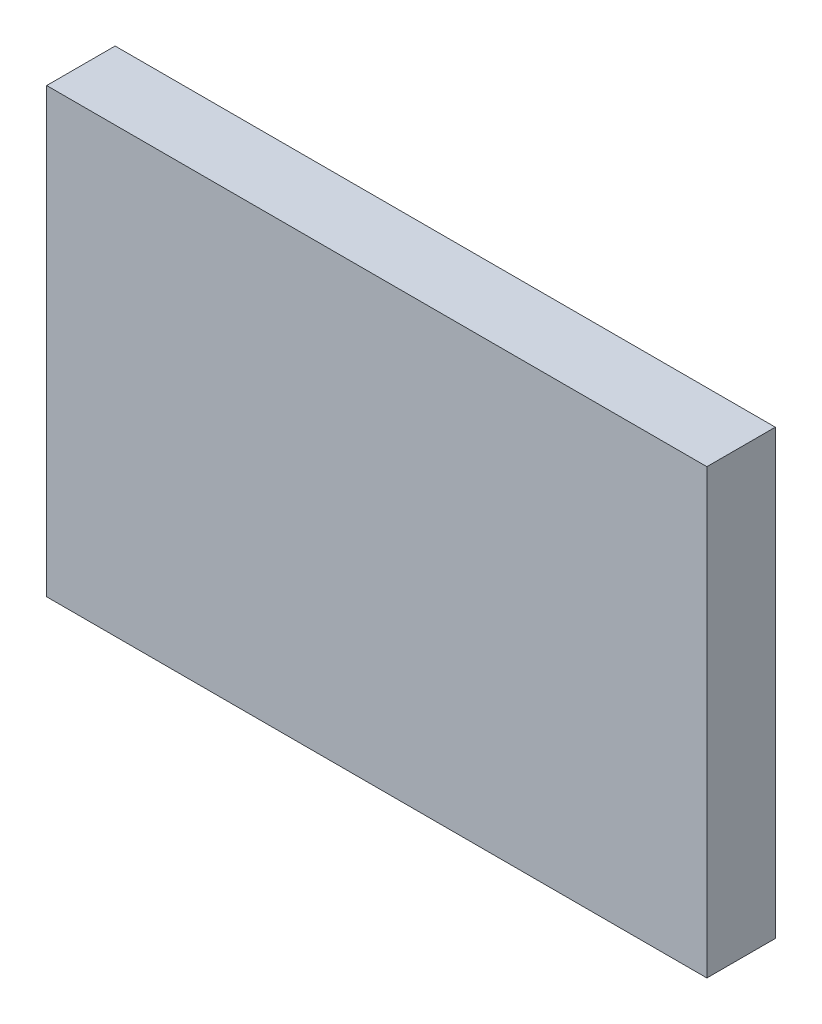
ISO-10303-21;
HEADER;
FILE_DESCRIPTION(('STEP AP214'),'2;1');
FILE_NAME('part.step','',(''),(''),'','','');
FILE_SCHEMA(('AUTOMOTIVE_DESIGN { 1 0 10303 214 1 1 1 1 }'));
ENDSEC;
DATA;
#1=APPLICATION_CONTEXT('core data for automotive mechanical design processes');
#2=APPLICATION_PROTOCOL_DEFINITION('international standard','automotive_design',2000,#1);
#3=PRODUCT_CONTEXT('',#1,'mechanical');
#4=PRODUCT('Part','Part','',(#3));
#5=PRODUCT_RELATED_PRODUCT_CATEGORY('part','',(#4));
#6=PRODUCT_DEFINITION_FORMATION('','',#4);
#7=PRODUCT_DEFINITION_CONTEXT('part definition',#1,'design');
#8=PRODUCT_DEFINITION('design','',#6,#7);
#9=PRODUCT_DEFINITION_SHAPE('','',#8);
#10=(LENGTH_UNIT() NAMED_UNIT(*) SI_UNIT(.MILLI.,.METRE.));
#11=(NAMED_UNIT(*) PLANE_ANGLE_UNIT() SI_UNIT($,.RADIAN.));
#12=(NAMED_UNIT(*) SI_UNIT($,.STERADIAN.) SOLID_ANGLE_UNIT());
#13=UNCERTAINTY_MEASURE_WITH_UNIT(LENGTH_MEASURE(1.E-05),#10,'distance_accuracy_value','');
#14=(GEOMETRIC_REPRESENTATION_CONTEXT(3) GLOBAL_UNCERTAINTY_ASSIGNED_CONTEXT((#13)) GLOBAL_UNIT_ASSIGNED_CONTEXT((#10,
#11,#12)) REPRESENTATION_CONTEXT('',''));
#15=CARTESIAN_POINT('',(0.,0.,0.));
#16=DIRECTION('',(0.,0.,1.));
#17=DIRECTION('',(1.,0.,0.));
#18=AXIS2_PLACEMENT_3D('',#15,#16,#17);
#19=CARTESIAN_POINT('',(-36.968497715082,19.8457446808511,8.5));
#20=DIRECTION('',(1.,0.,0.));
#21=DIRECTION('',(0.,0.,-1.));
#22=AXIS2_PLACEMENT_3D('',#19,#20,#21);
#23=PLANE('',#22);
#24=DIRECTION('',(0.,-1.,0.));
#25=VECTOR('',#24,1.);
#26=CARTESIAN_POINT('',(-36.968497715082,19.8457446808511,0.));
#27=LINE('',#26,#25);
#28=CARTESIAN_POINT('',(-36.968497715082,19.8457446808511,0.));
#29=VERTEX_POINT('',#28);
#30=CARTESIAN_POINT('',(-36.968497715082,-35.1542553191489,0.));
#31=VERTEX_POINT('',#30);
#32=EDGE_CURVE('E100',#29,#31,#27,.T.);
#33=ORIENTED_EDGE('',*,*,#32,.T.);
#34=DIRECTION('',(0.,0.,-1.));
#35=VECTOR('',#34,1.);
#36=CARTESIAN_POINT('',(-36.968497715082,-35.1542553191489,8.5));
#37=LINE('',#36,#35);
#38=CARTESIAN_POINT('',(-36.968497715082,-35.1542553191489,8.5));
#39=VERTEX_POINT('',#38);
#40=EDGE_CURVE('E11',#39,#31,#37,.T.);
#41=ORIENTED_EDGE('',*,*,#40,.F.);
#42=DIRECTION('',(0.,-1.,0.));
#43=VECTOR('',#42,1.);
#44=CARTESIAN_POINT('',(-36.968497715082,19.8457446808511,8.5));
#45=LINE('',#44,#43);
#46=CARTESIAN_POINT('',(-36.968497715082,19.8457446808511,8.5));
#47=VERTEX_POINT('',#46);
#48=EDGE_CURVE('E88',#47,#39,#45,.T.);
#49=ORIENTED_EDGE('',*,*,#48,.F.);
#50=DIRECTION('',(0.,0.,-1.));
#51=VECTOR('',#50,1.);
#52=CARTESIAN_POINT('',(-36.968497715082,19.8457446808511,8.5));
#53=LINE('',#52,#51);
#54=EDGE_CURVE('E96',#47,#29,#53,.T.);
#55=ORIENTED_EDGE('',*,*,#54,.T.);
#56=EDGE_LOOP('',(#33,#41,#49,#55));
#57=FACE_BOUND('',#56,.T.);
#58=ADVANCED_FACE('F37',(#57),#23,.F.);
#59=CARTESIAN_POINT('',(-36.968497715082,-35.1542553191489,8.5));
#60=DIRECTION('',(0.,1.,0.));
#61=DIRECTION('',(0.,0.,1.));
#62=AXIS2_PLACEMENT_3D('',#59,#60,#61);
#63=PLANE('',#62);
#64=DIRECTION('',(1.,0.,0.));
#65=VECTOR('',#64,1.);
#66=CARTESIAN_POINT('',(-36.968497715082,-35.1542553191489,0.));
#67=LINE('',#66,#65);
#68=CARTESIAN_POINT('',(45.031502284918,-35.1542553191489,0.));
#69=VERTEX_POINT('',#68);
#70=EDGE_CURVE('E92',#31,#69,#67,.T.);
#71=ORIENTED_EDGE('',*,*,#70,.T.);
#72=DIRECTION('',(0.,0.,-1.));
#73=VECTOR('',#72,1.);
#74=CARTESIAN_POINT('',(45.031502284918,-35.1542553191489,8.5));
#75=LINE('',#74,#73);
#76=CARTESIAN_POINT('',(45.031502284918,-35.1542553191489,8.5));
#77=VERTEX_POINT('',#76);
#78=EDGE_CURVE('E45',#77,#69,#75,.T.);
#79=ORIENTED_EDGE('',*,*,#78,.F.);
#80=DIRECTION('',(1.,0.,0.));
#81=VECTOR('',#80,1.);
#82=CARTESIAN_POINT('',(-36.968497715082,-35.1542553191489,8.5));
#83=LINE('',#82,#81);
#84=EDGE_CURVE('E83',#39,#77,#83,.T.);
#85=ORIENTED_EDGE('',*,*,#84,.F.);
#86=ORIENTED_EDGE('',*,*,#40,.T.);
#87=EDGE_LOOP('',(#71,#79,#85,#86));
#88=FACE_BOUND('',#87,.T.);
#89=ADVANCED_FACE('F91',(#88),#63,.F.);
#90=CARTESIAN_POINT('',(45.031502284918,19.8457446808511,8.5));
#91=DIRECTION('',(-1.,0.,0.));
#92=DIRECTION('',(0.,-1.,0.));
#93=AXIS2_PLACEMENT_3D('',#90,#91,#92);
#94=PLANE('',#93);
#95=DIRECTION('',(0.,1.,0.));
#96=VECTOR('',#95,1.);
#97=CARTESIAN_POINT('',(45.031502284918,19.8457446808511,0.));
#98=LINE('',#97,#96);
#99=CARTESIAN_POINT('',(45.031502284918,19.8457446808511,0.));
#100=VERTEX_POINT('',#99);
#101=EDGE_CURVE('E70',#69,#100,#98,.T.);
#102=ORIENTED_EDGE('',*,*,#101,.T.);
#103=DIRECTION('',(0.,0.,-1.));
#104=VECTOR('',#103,1.);
#105=CARTESIAN_POINT('',(45.031502284918,19.8457446808511,8.5));
#106=LINE('',#105,#104);
#107=CARTESIAN_POINT('',(45.031502284918,19.8457446808511,8.5));
#108=VERTEX_POINT('',#107);
#109=EDGE_CURVE('E93',#108,#100,#106,.T.);
#110=ORIENTED_EDGE('',*,*,#109,.F.);
#111=DIRECTION('',(0.,1.,0.));
#112=VECTOR('',#111,1.);
#113=CARTESIAN_POINT('',(45.031502284918,19.8457446808511,8.5));
#114=LINE('',#113,#112);
#115=EDGE_CURVE('E86',#77,#108,#114,.T.);
#116=ORIENTED_EDGE('',*,*,#115,.F.);
#117=ORIENTED_EDGE('',*,*,#78,.T.);
#118=EDGE_LOOP('',(#102,#110,#116,#117));
#119=FACE_BOUND('',#118,.T.);
#120=ADVANCED_FACE('F94',(#119),#94,.F.);
#121=CARTESIAN_POINT('',(-36.968497715082,19.8457446808511,8.5));
#122=DIRECTION('',(0.,-1.,0.));
#123=DIRECTION('',(0.,0.,-1.));
#124=AXIS2_PLACEMENT_3D('',#121,#122,#123);
#125=PLANE('',#124);
#126=DIRECTION('',(-1.,0.,0.));
#127=VECTOR('',#126,1.);
#128=CARTESIAN_POINT('',(-36.968497715082,19.8457446808511,0.));
#129=LINE('',#128,#127);
#130=EDGE_CURVE('E76',#100,#29,#129,.T.);
#131=ORIENTED_EDGE('',*,*,#130,.T.);
#132=ORIENTED_EDGE('',*,*,#54,.F.);
#133=DIRECTION('',(-1.,0.,0.));
#134=VECTOR('',#133,1.);
#135=CARTESIAN_POINT('',(-36.968497715082,19.8457446808511,8.5));
#136=LINE('',#135,#134);
#137=EDGE_CURVE('E53',#108,#47,#136,.T.);
#138=ORIENTED_EDGE('',*,*,#137,.F.);
#139=ORIENTED_EDGE('',*,*,#109,.T.);
#140=EDGE_LOOP('',(#131,#132,#138,#139));
#141=FACE_BOUND('',#140,.T.);
#142=ADVANCED_FACE('F107',(#141),#125,.F.);
#143=CARTESIAN_POINT('',(0.,0.,8.5));
#144=DIRECTION('',(0.,0.,1.));
#145=DIRECTION('',(1.,0.,0.));
#146=AXIS2_PLACEMENT_3D('',#143,#144,#145);
#147=PLANE('',#146);
#148=ORIENTED_EDGE('',*,*,#48,.T.);
#149=ORIENTED_EDGE('',*,*,#84,.T.);
#150=ORIENTED_EDGE('',*,*,#115,.T.);
#151=ORIENTED_EDGE('',*,*,#137,.T.);
#152=EDGE_LOOP('',(#148,#149,#150,#151));
#153=FACE_BOUND('',#152,.T.);
#154=ADVANCED_FACE('F84',(#153),#147,.T.);
#155=CARTESIAN_POINT('',(0.,0.,0.));
#156=DIRECTION('',(0.,0.,1.));
#157=DIRECTION('',(1.,0.,0.));
#158=AXIS2_PLACEMENT_3D('',#155,#156,#157);
#159=PLANE('',#158);
#160=ORIENTED_EDGE('',*,*,#32,.F.);
#161=ORIENTED_EDGE('',*,*,#130,.F.);
#162=ORIENTED_EDGE('',*,*,#101,.F.);
#163=ORIENTED_EDGE('',*,*,#70,.F.);
#164=EDGE_LOOP('',(#160,#161,#162,#163));
#165=FACE_BOUND('',#164,.T.);
#166=ADVANCED_FACE('F110',(#165),#159,.F.);
#167=CLOSED_SHELL('',(#58,#89,#120,#142,#154,#166));
#168=MANIFOLD_SOLID_BREP('B2',#167);
#169=ADVANCED_BREP_SHAPE_REPRESENTATION('',(#18,#168),#14);
#170=SHAPE_DEFINITION_REPRESENTATION(#9,#169);
ENDSEC;
END-ISO-10303-21;
